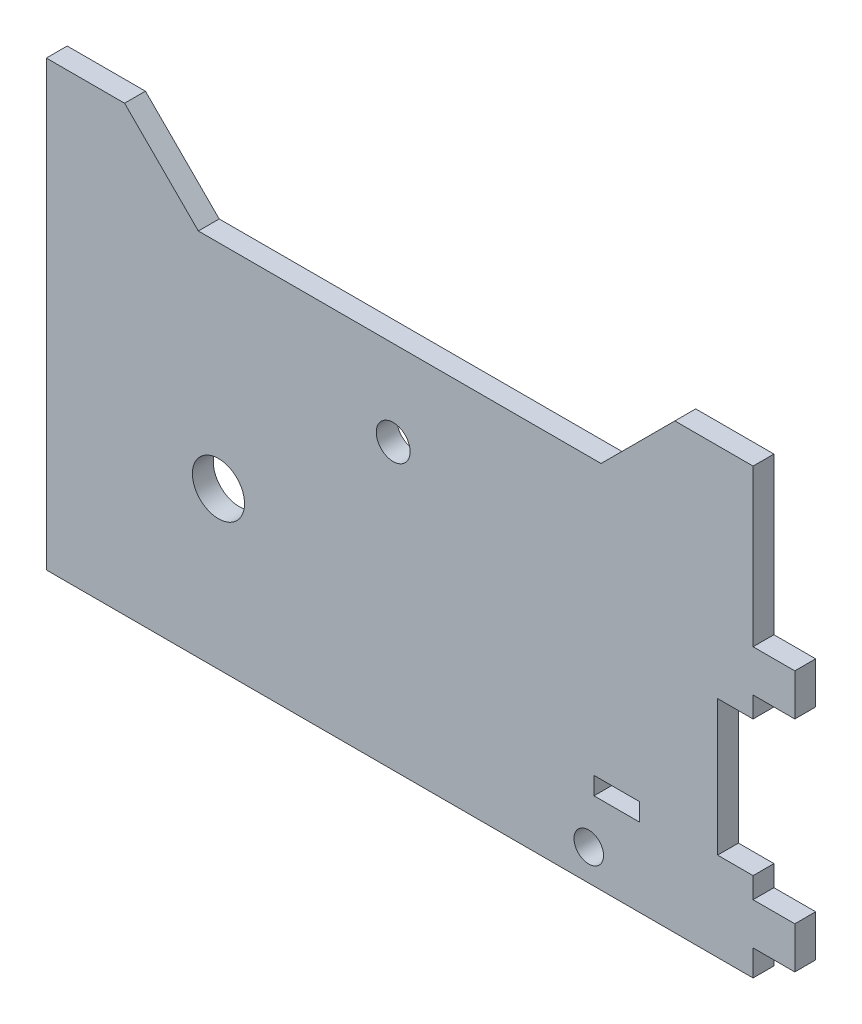
ISO-10303-21;
HEADER;
FILE_DESCRIPTION(('STEP AP214'),'2;1');
FILE_NAME('part.step','',(''),(''),'','','');
FILE_SCHEMA(('AUTOMOTIVE_DESIGN { 1 0 10303 214 1 1 1 1 }'));
ENDSEC;
DATA;
#1=APPLICATION_CONTEXT('core data for automotive mechanical design processes');
#2=APPLICATION_PROTOCOL_DEFINITION('international standard','automotive_design',2000,#1);
#3=PRODUCT_CONTEXT('',#1,'mechanical');
#4=PRODUCT('Part','Part','',(#3));
#5=PRODUCT_RELATED_PRODUCT_CATEGORY('part','',(#4));
#6=PRODUCT_DEFINITION_FORMATION('','',#4);
#7=PRODUCT_DEFINITION_CONTEXT('part definition',#1,'design');
#8=PRODUCT_DEFINITION('design','',#6,#7);
#9=PRODUCT_DEFINITION_SHAPE('','',#8);
#10=(LENGTH_UNIT() NAMED_UNIT(*) SI_UNIT(.MILLI.,.METRE.));
#11=(NAMED_UNIT(*) PLANE_ANGLE_UNIT() SI_UNIT($,.RADIAN.));
#12=(NAMED_UNIT(*) SI_UNIT($,.STERADIAN.) SOLID_ANGLE_UNIT());
#13=UNCERTAINTY_MEASURE_WITH_UNIT(LENGTH_MEASURE(1.E-05),#10,'distance_accuracy_value','');
#14=(GEOMETRIC_REPRESENTATION_CONTEXT(3) GLOBAL_UNCERTAINTY_ASSIGNED_CONTEXT((#13)) GLOBAL_UNIT_ASSIGNED_CONTEXT((#10,
#11,#12)) REPRESENTATION_CONTEXT('',''));
#15=CARTESIAN_POINT('',(0.,0.,0.));
#16=DIRECTION('',(0.,0.,1.));
#17=DIRECTION('',(1.,0.,0.));
#18=AXIS2_PLACEMENT_3D('',#15,#16,#17);
#19=CARTESIAN_POINT('',(0.,0.,4.));
#20=DIRECTION('',(0.,0.,-1.));
#21=DIRECTION('',(-1.,0.,0.));
#22=AXIS2_PLACEMENT_3D('',#19,#20,#21);
#23=PLANE('',#22);
#24=CARTESIAN_POINT('',(-46.,0.,4.));
#25=DIRECTION('',(0.,0.,1.));
#26=DIRECTION('',(1.,0.,0.));
#27=AXIS2_PLACEMENT_3D('',#24,#25,#26);
#28=CIRCLE('',#27,5.);
#29=CARTESIAN_POINT('',(-41.,0.,4.));
#30=VERTEX_POINT('',#29);
#31=EDGE_CURVE('E287',#30,#30,#28,.T.);
#32=ORIENTED_EDGE('',*,*,#31,.F.);
#33=EDGE_LOOP('',(#32));
#34=FACE_BOUND('',#33,.T.);
#35=CARTESIAN_POINT('',(-12.5,24.5,4.));
#36=DIRECTION('',(0.,0.,1.));
#37=DIRECTION('',(1.,0.,0.));
#38=AXIS2_PLACEMENT_3D('',#35,#36,#37);
#39=CIRCLE('',#38,3.25);
#40=CARTESIAN_POINT('',(-9.25,24.5,4.));
#41=VERTEX_POINT('',#40);
#42=EDGE_CURVE('E293',#41,#41,#39,.T.);
#43=ORIENTED_EDGE('',*,*,#42,.F.);
#44=EDGE_LOOP('',(#43));
#45=FACE_BOUND('',#44,.T.);
#46=DIRECTION('',(0.,1.,0.));
#47=VECTOR('',#46,1.);
#48=CARTESIAN_POINT('',(56.5,30.,4.));
#49=LINE('',#48,#47);
#50=CARTESIAN_POINT('',(56.5,25.,4.));
#51=VERTEX_POINT('',#50);
#52=CARTESIAN_POINT('',(56.5,55.,4.));
#53=VERTEX_POINT('',#52);
#54=EDGE_CURVE('E195',#51,#53,#49,.T.);
#55=ORIENTED_EDGE('',*,*,#54,.T.);
#56=DIRECTION('',(-1.,0.,0.));
#57=VECTOR('',#56,1.);
#58=CARTESIAN_POINT('',(56.5,55.,4.));
#59=LINE('',#58,#57);
#60=CARTESIAN_POINT('',(41.5,55.,4.));
#61=VERTEX_POINT('',#60);
#62=EDGE_CURVE('E199',#53,#61,#59,.T.);
#63=ORIENTED_EDGE('',*,*,#62,.T.);
#64=DIRECTION('',(-0.707106781186548,-0.707106781186547,0.));
#65=VECTOR('',#64,1.);
#66=CARTESIAN_POINT('',(41.5,55.,4.));
#67=LINE('',#66,#65);
#68=CARTESIAN_POINT('',(27.357864376269,40.857864376269,4.));
#69=VERTEX_POINT('',#68);
#70=EDGE_CURVE('E221',#61,#69,#67,.T.);
#71=ORIENTED_EDGE('',*,*,#70,.T.);
#72=DIRECTION('',(-1.,0.,0.));
#73=VECTOR('',#72,1.);
#74=CARTESIAN_POINT('',(27.357864376269,40.857864376269,4.));
#75=LINE('',#74,#73);
#76=CARTESIAN_POINT('',(-49.8578643762691,40.857864376269,4.));
#77=VERTEX_POINT('',#76);
#78=EDGE_CURVE('E224',#69,#77,#75,.T.);
#79=ORIENTED_EDGE('',*,*,#78,.T.);
#80=DIRECTION('',(-0.707106781186546,0.707106781186549,0.));
#81=VECTOR('',#80,1.);
#82=CARTESIAN_POINT('',(-49.8578643762691,40.857864376269,4.));
#83=LINE('',#82,#81);
#84=CARTESIAN_POINT('',(-64.,55.,4.));
#85=VERTEX_POINT('',#84);
#86=EDGE_CURVE('E231',#77,#85,#83,.T.);
#87=ORIENTED_EDGE('',*,*,#86,.T.);
#88=DIRECTION('',(-1.,0.,0.));
#89=VECTOR('',#88,1.);
#90=CARTESIAN_POINT('',(-64.,55.,4.));
#91=LINE('',#90,#89);
#92=CARTESIAN_POINT('',(-79.,55.,4.));
#93=VERTEX_POINT('',#92);
#94=EDGE_CURVE('E233',#85,#93,#91,.T.);
#95=ORIENTED_EDGE('',*,*,#94,.T.);
#96=DIRECTION('',(0.,-1.,0.));
#97=VECTOR('',#96,1.);
#98=CARTESIAN_POINT('',(-79.,-30.,4.));
#99=LINE('',#98,#97);
#100=CARTESIAN_POINT('',(-79.,-30.,4.));
#101=VERTEX_POINT('',#100);
#102=EDGE_CURVE('E299',#93,#101,#99,.T.);
#103=ORIENTED_EDGE('',*,*,#102,.T.);
#104=DIRECTION('',(1.,0.,0.));
#105=VECTOR('',#104,1.);
#106=CARTESIAN_POINT('',(-79.,-30.,4.));
#107=LINE('',#106,#105);
#108=CARTESIAN_POINT('',(56.5,-30.,4.));
#109=VERTEX_POINT('',#108);
#110=EDGE_CURVE('E301',#101,#109,#107,.T.);
#111=ORIENTED_EDGE('',*,*,#110,.T.);
#112=DIRECTION('',(0.,1.,0.));
#113=VECTOR('',#112,1.);
#114=CARTESIAN_POINT('',(56.5,-25.,4.));
#115=LINE('',#114,#113);
#116=CARTESIAN_POINT('',(56.5,-25.,4.));
#117=VERTEX_POINT('',#116);
#118=EDGE_CURVE('E303',#109,#117,#115,.T.);
#119=ORIENTED_EDGE('',*,*,#118,.T.);
#120=DIRECTION('',(1.,0.,0.));
#121=VECTOR('',#120,1.);
#122=CARTESIAN_POINT('',(64.5,-25.,4.));
#123=LINE('',#122,#121);
#124=CARTESIAN_POINT('',(64.5,-25.,4.));
#125=VERTEX_POINT('',#124);
#126=EDGE_CURVE('E305',#117,#125,#123,.T.);
#127=ORIENTED_EDGE('',*,*,#126,.T.);
#128=DIRECTION('',(0.,1.,0.));
#129=VECTOR('',#128,1.);
#130=CARTESIAN_POINT('',(64.5,-17.,4.));
#131=LINE('',#130,#129);
#132=CARTESIAN_POINT('',(64.5,-17.,4.));
#133=VERTEX_POINT('',#132);
#134=EDGE_CURVE('E307',#125,#133,#131,.T.);
#135=ORIENTED_EDGE('',*,*,#134,.T.);
#136=DIRECTION('',(-1.,0.,0.));
#137=VECTOR('',#136,1.);
#138=CARTESIAN_POINT('',(56.5,-17.,4.));
#139=LINE('',#138,#137);
#140=CARTESIAN_POINT('',(56.5,-17.,4.));
#141=VERTEX_POINT('',#140);
#142=EDGE_CURVE('E309',#133,#141,#139,.T.);
#143=ORIENTED_EDGE('',*,*,#142,.T.);
#144=DIRECTION('',(0.,1.,0.));
#145=VECTOR('',#144,1.);
#146=CARTESIAN_POINT('',(56.5,-13.,4.));
#147=LINE('',#146,#145);
#148=CARTESIAN_POINT('',(56.5,-13.,4.));
#149=VERTEX_POINT('',#148);
#150=EDGE_CURVE('E311',#141,#149,#147,.T.);
#151=ORIENTED_EDGE('',*,*,#150,.T.);
#152=DIRECTION('',(-1.,0.,0.));
#153=VECTOR('',#152,1.);
#154=CARTESIAN_POINT('',(49.7,-13.,4.));
#155=LINE('',#154,#153);
#156=CARTESIAN_POINT('',(49.7,-13.,4.));
#157=VERTEX_POINT('',#156);
#158=EDGE_CURVE('E313',#149,#157,#155,.T.);
#159=ORIENTED_EDGE('',*,*,#158,.T.);
#160=DIRECTION('',(0.,1.,0.));
#161=VECTOR('',#160,1.);
#162=CARTESIAN_POINT('',(49.7,13.,4.));
#163=LINE('',#162,#161);
#164=CARTESIAN_POINT('',(49.7,13.,4.));
#165=VERTEX_POINT('',#164);
#166=EDGE_CURVE('E315',#157,#165,#163,.T.);
#167=ORIENTED_EDGE('',*,*,#166,.T.);
#168=DIRECTION('',(1.,0.,0.));
#169=VECTOR('',#168,1.);
#170=CARTESIAN_POINT('',(56.5,13.,4.));
#171=LINE('',#170,#169);
#172=CARTESIAN_POINT('',(56.5,13.,4.));
#173=VERTEX_POINT('',#172);
#174=EDGE_CURVE('E317',#165,#173,#171,.T.);
#175=ORIENTED_EDGE('',*,*,#174,.T.);
#176=DIRECTION('',(0.,1.,0.));
#177=VECTOR('',#176,1.);
#178=CARTESIAN_POINT('',(56.5,17.,4.));
#179=LINE('',#178,#177);
#180=CARTESIAN_POINT('',(56.5,17.,4.));
#181=VERTEX_POINT('',#180);
#182=EDGE_CURVE('E319',#173,#181,#179,.T.);
#183=ORIENTED_EDGE('',*,*,#182,.T.);
#184=DIRECTION('',(1.,0.,0.));
#185=VECTOR('',#184,1.);
#186=CARTESIAN_POINT('',(64.5,17.,4.));
#187=LINE('',#186,#185);
#188=CARTESIAN_POINT('',(64.5,17.,4.));
#189=VERTEX_POINT('',#188);
#190=EDGE_CURVE('E321',#181,#189,#187,.T.);
#191=ORIENTED_EDGE('',*,*,#190,.T.);
#192=DIRECTION('',(0.,1.,0.));
#193=VECTOR('',#192,1.);
#194=CARTESIAN_POINT('',(64.5,25.,4.));
#195=LINE('',#194,#193);
#196=CARTESIAN_POINT('',(64.5,25.,4.));
#197=VERTEX_POINT('',#196);
#198=EDGE_CURVE('E323',#189,#197,#195,.T.);
#199=ORIENTED_EDGE('',*,*,#198,.T.);
#200=DIRECTION('',(-1.,0.,0.));
#201=VECTOR('',#200,1.);
#202=CARTESIAN_POINT('',(56.5,25.,4.));
#203=LINE('',#202,#201);
#204=EDGE_CURVE('E202',#197,#51,#203,.T.);
#205=ORIENTED_EDGE('',*,*,#204,.T.);
#206=EDGE_LOOP('',(#55,#63,#71,#79,#87,#95,#103,#111,#119,#127,#135,#143,#151,#159,#167,#175,
#183,#191,#199,#205));
#207=FACE_BOUND('',#206,.T.);
#208=DIRECTION('',(0.,-1.,0.));
#209=VECTOR('',#208,1.);
#210=CARTESIAN_POINT('',(26.,-11.6,4.));
#211=LINE('',#210,#209);
#212=CARTESIAN_POINT('',(26.,-11.6,4.));
#213=VERTEX_POINT('',#212);
#214=CARTESIAN_POINT('',(26.,-15.,4.));
#215=VERTEX_POINT('',#214);
#216=EDGE_CURVE('E261',#213,#215,#211,.T.);
#217=ORIENTED_EDGE('',*,*,#216,.F.);
#218=DIRECTION('',(-1.,0.,0.));
#219=VECTOR('',#218,1.);
#220=CARTESIAN_POINT('',(26.,-11.6,4.));
#221=LINE('',#220,#219);
#222=CARTESIAN_POINT('',(34.7,-11.6,4.));
#223=VERTEX_POINT('',#222);
#224=EDGE_CURVE('E268',#223,#213,#221,.T.);
#225=ORIENTED_EDGE('',*,*,#224,.F.);
#226=DIRECTION('',(0.,1.,0.));
#227=VECTOR('',#226,1.);
#228=CARTESIAN_POINT('',(34.7,-11.6,4.));
#229=LINE('',#228,#227);
#230=CARTESIAN_POINT('',(34.7,-15.,4.));
#231=VERTEX_POINT('',#230);
#232=EDGE_CURVE('E266',#231,#223,#229,.T.);
#233=ORIENTED_EDGE('',*,*,#232,.F.);
#234=DIRECTION('',(1.,0.,0.));
#235=VECTOR('',#234,1.);
#236=CARTESIAN_POINT('',(26.,-15.,4.));
#237=LINE('',#236,#235);
#238=EDGE_CURVE('E263',#215,#231,#237,.T.);
#239=ORIENTED_EDGE('',*,*,#238,.F.);
#240=EDGE_LOOP('',(#217,#225,#233,#239));
#241=FACE_BOUND('',#240,.T.);
#242=CARTESIAN_POINT('',(25.,-24.,4.));
#243=DIRECTION('',(0.,0.,1.));
#244=DIRECTION('',(1.,0.,0.));
#245=AXIS2_PLACEMENT_3D('',#242,#243,#244);
#246=CIRCLE('',#245,2.83);
#247=CARTESIAN_POINT('',(27.83,-24.,4.));
#248=VERTEX_POINT('',#247);
#249=EDGE_CURVE('E256',#248,#248,#246,.T.);
#250=ORIENTED_EDGE('',*,*,#249,.F.);
#251=EDGE_LOOP('',(#250));
#252=FACE_BOUND('',#251,.T.);
#253=ADVANCED_FACE('F33',(#34,#45,#207,#241,#252),#23,.F.);
#254=CARTESIAN_POINT('',(0.,0.,0.));
#255=DIRECTION('',(0.,0.,-1.));
#256=DIRECTION('',(-1.,0.,0.));
#257=AXIS2_PLACEMENT_3D('',#254,#255,#256);
#258=PLANE('',#257);
#259=DIRECTION('',(-1.,0.,0.));
#260=VECTOR('',#259,1.);
#261=CARTESIAN_POINT('',(26.,-11.6,0.));
#262=LINE('',#261,#260);
#263=CARTESIAN_POINT('',(34.7,-11.6,0.));
#264=VERTEX_POINT('',#263);
#265=CARTESIAN_POINT('',(26.,-11.6,0.));
#266=VERTEX_POINT('',#265);
#267=EDGE_CURVE('E264',#264,#266,#262,.T.);
#268=ORIENTED_EDGE('',*,*,#267,.T.);
#269=DIRECTION('',(0.,-1.,0.));
#270=VECTOR('',#269,1.);
#271=CARTESIAN_POINT('',(26.,-11.6,0.));
#272=LINE('',#271,#270);
#273=CARTESIAN_POINT('',(26.,-15.,0.));
#274=VERTEX_POINT('',#273);
#275=EDGE_CURVE('E56',#266,#274,#272,.T.);
#276=ORIENTED_EDGE('',*,*,#275,.T.);
#277=DIRECTION('',(1.,0.,0.));
#278=VECTOR('',#277,1.);
#279=CARTESIAN_POINT('',(26.,-15.,0.));
#280=LINE('',#279,#278);
#281=CARTESIAN_POINT('',(34.7,-15.,0.));
#282=VERTEX_POINT('',#281);
#283=EDGE_CURVE('E272',#274,#282,#280,.T.);
#284=ORIENTED_EDGE('',*,*,#283,.T.);
#285=DIRECTION('',(0.,1.,0.));
#286=VECTOR('',#285,1.);
#287=CARTESIAN_POINT('',(34.7,-11.6,0.));
#288=LINE('',#287,#286);
#289=EDGE_CURVE('E275',#282,#264,#288,.T.);
#290=ORIENTED_EDGE('',*,*,#289,.T.);
#291=EDGE_LOOP('',(#268,#276,#284,#290));
#292=FACE_BOUND('',#291,.T.);
#293=CARTESIAN_POINT('',(-46.,0.,0.));
#294=DIRECTION('',(0.,0.,1.));
#295=DIRECTION('',(1.,0.,0.));
#296=AXIS2_PLACEMENT_3D('',#293,#294,#295);
#297=CIRCLE('',#296,5.);
#298=CARTESIAN_POINT('',(-41.,0.,0.));
#299=VERTEX_POINT('',#298);
#300=EDGE_CURVE('E286',#299,#299,#297,.T.);
#301=ORIENTED_EDGE('',*,*,#300,.T.);
#302=EDGE_LOOP('',(#301));
#303=FACE_BOUND('',#302,.T.);
#304=DIRECTION('',(0.,-1.,0.));
#305=VECTOR('',#304,1.);
#306=CARTESIAN_POINT('',(-79.,-30.,0.));
#307=LINE('',#306,#305);
#308=CARTESIAN_POINT('',(-79.,55.,0.));
#309=VERTEX_POINT('',#308);
#310=CARTESIAN_POINT('',(-79.,-30.,0.));
#311=VERTEX_POINT('',#310);
#312=EDGE_CURVE('E296',#309,#311,#307,.T.);
#313=ORIENTED_EDGE('',*,*,#312,.F.);
#314=DIRECTION('',(-1.,0.,0.));
#315=VECTOR('',#314,1.);
#316=CARTESIAN_POINT('',(-64.,55.,0.));
#317=LINE('',#316,#315);
#318=CARTESIAN_POINT('',(-64.,55.,0.));
#319=VERTEX_POINT('',#318);
#320=EDGE_CURVE('E222',#319,#309,#317,.T.);
#321=ORIENTED_EDGE('',*,*,#320,.F.);
#322=DIRECTION('',(-0.707106781186546,0.707106781186549,0.));
#323=VECTOR('',#322,1.);
#324=CARTESIAN_POINT('',(-49.8578643762691,40.857864376269,0.));
#325=LINE('',#324,#323);
#326=CARTESIAN_POINT('',(-49.8578643762691,40.857864376269,0.));
#327=VERTEX_POINT('',#326);
#328=EDGE_CURVE('E227',#327,#319,#325,.T.);
#329=ORIENTED_EDGE('',*,*,#328,.F.);
#330=DIRECTION('',(-1.,0.,0.));
#331=VECTOR('',#330,1.);
#332=CARTESIAN_POINT('',(27.357864376269,40.857864376269,0.));
#333=LINE('',#332,#331);
#334=CARTESIAN_POINT('',(27.357864376269,40.857864376269,0.));
#335=VERTEX_POINT('',#334);
#336=EDGE_CURVE('E241',#335,#327,#333,.T.);
#337=ORIENTED_EDGE('',*,*,#336,.F.);
#338=DIRECTION('',(-0.707106781186548,-0.707106781186547,0.));
#339=VECTOR('',#338,1.);
#340=CARTESIAN_POINT('',(41.5,55.,0.));
#341=LINE('',#340,#339);
#342=CARTESIAN_POINT('',(41.5,55.,0.));
#343=VERTEX_POINT('',#342);
#344=EDGE_CURVE('E239',#343,#335,#341,.T.);
#345=ORIENTED_EDGE('',*,*,#344,.F.);
#346=DIRECTION('',(-1.,0.,0.));
#347=VECTOR('',#346,1.);
#348=CARTESIAN_POINT('',(56.5,55.,0.));
#349=LINE('',#348,#347);
#350=CARTESIAN_POINT('',(56.5,55.,0.));
#351=VERTEX_POINT('',#350);
#352=EDGE_CURVE('E237',#351,#343,#349,.T.);
#353=ORIENTED_EDGE('',*,*,#352,.F.);
#354=DIRECTION('',(0.,1.,0.));
#355=VECTOR('',#354,1.);
#356=CARTESIAN_POINT('',(56.5,30.,0.));
#357=LINE('',#356,#355);
#358=CARTESIAN_POINT('',(56.5,25.,0.));
#359=VERTEX_POINT('',#358);
#360=EDGE_CURVE('E212',#359,#351,#357,.T.);
#361=ORIENTED_EDGE('',*,*,#360,.F.);
#362=DIRECTION('',(-1.,0.,0.));
#363=VECTOR('',#362,1.);
#364=CARTESIAN_POINT('',(56.5,25.,0.));
#365=LINE('',#364,#363);
#366=CARTESIAN_POINT('',(64.5,25.,0.));
#367=VERTEX_POINT('',#366);
#368=EDGE_CURVE('E352',#367,#359,#365,.T.);
#369=ORIENTED_EDGE('',*,*,#368,.F.);
#370=DIRECTION('',(0.,1.,0.));
#371=VECTOR('',#370,1.);
#372=CARTESIAN_POINT('',(64.5,25.,0.));
#373=LINE('',#372,#371);
#374=CARTESIAN_POINT('',(64.5,17.,0.));
#375=VERTEX_POINT('',#374);
#376=EDGE_CURVE('E350',#375,#367,#373,.T.);
#377=ORIENTED_EDGE('',*,*,#376,.F.);
#378=DIRECTION('',(1.,0.,0.));
#379=VECTOR('',#378,1.);
#380=CARTESIAN_POINT('',(64.5,17.,0.));
#381=LINE('',#380,#379);
#382=CARTESIAN_POINT('',(56.5,17.,0.));
#383=VERTEX_POINT('',#382);
#384=EDGE_CURVE('E348',#383,#375,#381,.T.);
#385=ORIENTED_EDGE('',*,*,#384,.F.);
#386=DIRECTION('',(0.,1.,0.));
#387=VECTOR('',#386,1.);
#388=CARTESIAN_POINT('',(56.5,17.,0.));
#389=LINE('',#388,#387);
#390=CARTESIAN_POINT('',(56.5,13.,0.));
#391=VERTEX_POINT('',#390);
#392=EDGE_CURVE('E346',#391,#383,#389,.T.);
#393=ORIENTED_EDGE('',*,*,#392,.F.);
#394=DIRECTION('',(1.,0.,0.));
#395=VECTOR('',#394,1.);
#396=CARTESIAN_POINT('',(56.5,13.,0.));
#397=LINE('',#396,#395);
#398=CARTESIAN_POINT('',(49.7,13.,0.));
#399=VERTEX_POINT('',#398);
#400=EDGE_CURVE('E344',#399,#391,#397,.T.);
#401=ORIENTED_EDGE('',*,*,#400,.F.);
#402=DIRECTION('',(0.,1.,0.));
#403=VECTOR('',#402,1.);
#404=CARTESIAN_POINT('',(49.7,13.,0.));
#405=LINE('',#404,#403);
#406=CARTESIAN_POINT('',(49.7,-13.,0.));
#407=VERTEX_POINT('',#406);
#408=EDGE_CURVE('E342',#407,#399,#405,.T.);
#409=ORIENTED_EDGE('',*,*,#408,.F.);
#410=DIRECTION('',(-1.,0.,0.));
#411=VECTOR('',#410,1.);
#412=CARTESIAN_POINT('',(49.7,-13.,0.));
#413=LINE('',#412,#411);
#414=CARTESIAN_POINT('',(56.5,-13.,0.));
#415=VERTEX_POINT('',#414);
#416=EDGE_CURVE('E340',#415,#407,#413,.T.);
#417=ORIENTED_EDGE('',*,*,#416,.F.);
#418=DIRECTION('',(0.,1.,0.));
#419=VECTOR('',#418,1.);
#420=CARTESIAN_POINT('',(56.5,-13.,0.));
#421=LINE('',#420,#419);
#422=CARTESIAN_POINT('',(56.5,-17.,0.));
#423=VERTEX_POINT('',#422);
#424=EDGE_CURVE('E338',#423,#415,#421,.T.);
#425=ORIENTED_EDGE('',*,*,#424,.F.);
#426=DIRECTION('',(-1.,0.,0.));
#427=VECTOR('',#426,1.);
#428=CARTESIAN_POINT('',(56.5,-17.,0.));
#429=LINE('',#428,#427);
#430=CARTESIAN_POINT('',(64.5,-17.,0.));
#431=VERTEX_POINT('',#430);
#432=EDGE_CURVE('E336',#431,#423,#429,.T.);
#433=ORIENTED_EDGE('',*,*,#432,.F.);
#434=DIRECTION('',(0.,1.,0.));
#435=VECTOR('',#434,1.);
#436=CARTESIAN_POINT('',(64.5,-17.,0.));
#437=LINE('',#436,#435);
#438=CARTESIAN_POINT('',(64.5,-25.,0.));
#439=VERTEX_POINT('',#438);
#440=EDGE_CURVE('E334',#439,#431,#437,.T.);
#441=ORIENTED_EDGE('',*,*,#440,.F.);
#442=DIRECTION('',(1.,0.,0.));
#443=VECTOR('',#442,1.);
#444=CARTESIAN_POINT('',(64.5,-25.,0.));
#445=LINE('',#444,#443);
#446=CARTESIAN_POINT('',(56.5,-25.,0.));
#447=VERTEX_POINT('',#446);
#448=EDGE_CURVE('E332',#447,#439,#445,.T.);
#449=ORIENTED_EDGE('',*,*,#448,.F.);
#450=DIRECTION('',(0.,1.,0.));
#451=VECTOR('',#450,1.);
#452=CARTESIAN_POINT('',(56.5,-25.,0.));
#453=LINE('',#452,#451);
#454=CARTESIAN_POINT('',(56.5,-30.,0.));
#455=VERTEX_POINT('',#454);
#456=EDGE_CURVE('E330',#455,#447,#453,.T.);
#457=ORIENTED_EDGE('',*,*,#456,.F.);
#458=DIRECTION('',(1.,0.,0.));
#459=VECTOR('',#458,1.);
#460=CARTESIAN_POINT('',(56.5,-30.,0.));
#461=LINE('',#460,#459);
#462=EDGE_CURVE('E328',#311,#455,#461,.T.);
#463=ORIENTED_EDGE('',*,*,#462,.F.);
#464=EDGE_LOOP('',(#313,#321,#329,#337,#345,#353,#361,#369,#377,#385,#393,#401,#409,#417,#425,
#433,#441,#449,#457,#463));
#465=FACE_BOUND('',#464,.T.);
#466=CARTESIAN_POINT('',(-12.5,24.5,0.));
#467=DIRECTION('',(0.,0.,1.));
#468=DIRECTION('',(1.,0.,0.));
#469=AXIS2_PLACEMENT_3D('',#466,#467,#468);
#470=CIRCLE('',#469,3.25);
#471=CARTESIAN_POINT('',(-9.25,24.5,0.));
#472=VERTEX_POINT('',#471);
#473=EDGE_CURVE('E290',#472,#472,#470,.T.);
#474=ORIENTED_EDGE('',*,*,#473,.T.);
#475=EDGE_LOOP('',(#474));
#476=FACE_BOUND('',#475,.T.);
#477=CARTESIAN_POINT('',(25.,-24.,0.));
#478=DIRECTION('',(0.,0.,1.));
#479=DIRECTION('',(1.,0.,0.));
#480=AXIS2_PLACEMENT_3D('',#477,#478,#479);
#481=CIRCLE('',#480,2.83);
#482=CARTESIAN_POINT('',(27.83,-24.,0.));
#483=VERTEX_POINT('',#482);
#484=EDGE_CURVE('E215',#483,#483,#481,.T.);
#485=ORIENTED_EDGE('',*,*,#484,.T.);
#486=EDGE_LOOP('',(#485));
#487=FACE_BOUND('',#486,.T.);
#488=ADVANCED_FACE('F399',(#292,#303,#465,#476,#487),#258,.T.);
#489=CARTESIAN_POINT('',(-79.,-30.,4.));
#490=DIRECTION('',(1.,0.,0.));
#491=DIRECTION('',(0.,0.,-1.));
#492=AXIS2_PLACEMENT_3D('',#489,#490,#491);
#493=PLANE('',#492);
#494=ORIENTED_EDGE('',*,*,#312,.T.);
#495=DIRECTION('',(0.,0.,-1.));
#496=VECTOR('',#495,1.);
#497=CARTESIAN_POINT('',(-79.,-30.,4.));
#498=LINE('',#497,#496);
#499=EDGE_CURVE('E11',#101,#311,#498,.T.);
#500=ORIENTED_EDGE('',*,*,#499,.F.);
#501=ORIENTED_EDGE('',*,*,#102,.F.);
#502=DIRECTION('',(0.,0.,-1.));
#503=VECTOR('',#502,1.);
#504=CARTESIAN_POINT('',(-79.,55.,4.));
#505=LINE('',#504,#503);
#506=EDGE_CURVE('E236',#93,#309,#505,.T.);
#507=ORIENTED_EDGE('',*,*,#506,.T.);
#508=EDGE_LOOP('',(#494,#500,#501,#507));
#509=FACE_BOUND('',#508,.T.);
#510=ADVANCED_FACE('F35',(#509),#493,.F.);
#511=CARTESIAN_POINT('',(56.5,-30.,4.));
#512=DIRECTION('',(0.,1.,0.));
#513=DIRECTION('',(0.,0.,1.));
#514=AXIS2_PLACEMENT_3D('',#511,#512,#513);
#515=PLANE('',#514);
#516=ORIENTED_EDGE('',*,*,#462,.T.);
#517=DIRECTION('',(0.,0.,-1.));
#518=VECTOR('',#517,1.);
#519=CARTESIAN_POINT('',(56.5,-30.,4.));
#520=LINE('',#519,#518);
#521=EDGE_CURVE('E41',#109,#455,#520,.T.);
#522=ORIENTED_EDGE('',*,*,#521,.F.);
#523=ORIENTED_EDGE('',*,*,#110,.F.);
#524=ORIENTED_EDGE('',*,*,#499,.T.);
#525=EDGE_LOOP('',(#516,#522,#523,#524));
#526=FACE_BOUND('',#525,.T.);
#527=ADVANCED_FACE('F414',(#526),#515,.F.);
#528=CARTESIAN_POINT('',(56.5,-25.,4.));
#529=DIRECTION('',(-1.,0.,0.));
#530=DIRECTION('',(0.,-1.,0.));
#531=AXIS2_PLACEMENT_3D('',#528,#529,#530);
#532=PLANE('',#531);
#533=ORIENTED_EDGE('',*,*,#456,.T.);
#534=DIRECTION('',(0.,0.,-1.));
#535=VECTOR('',#534,1.);
#536=CARTESIAN_POINT('',(56.5,-25.,4.));
#537=LINE('',#536,#535);
#538=EDGE_CURVE('E386',#117,#447,#537,.T.);
#539=ORIENTED_EDGE('',*,*,#538,.F.);
#540=ORIENTED_EDGE('',*,*,#118,.F.);
#541=ORIENTED_EDGE('',*,*,#521,.T.);
#542=EDGE_LOOP('',(#533,#539,#540,#541));
#543=FACE_BOUND('',#542,.T.);
#544=ADVANCED_FACE('F393',(#543),#532,.F.);
#545=CARTESIAN_POINT('',(64.5,-25.,4.));
#546=DIRECTION('',(0.,1.,0.));
#547=DIRECTION('',(0.,0.,1.));
#548=AXIS2_PLACEMENT_3D('',#545,#546,#547);
#549=PLANE('',#548);
#550=ORIENTED_EDGE('',*,*,#448,.T.);
#551=DIRECTION('',(0.,0.,-1.));
#552=VECTOR('',#551,1.);
#553=CARTESIAN_POINT('',(64.5,-25.,4.));
#554=LINE('',#553,#552);
#555=EDGE_CURVE('E383',#125,#439,#554,.T.);
#556=ORIENTED_EDGE('',*,*,#555,.F.);
#557=ORIENTED_EDGE('',*,*,#126,.F.);
#558=ORIENTED_EDGE('',*,*,#538,.T.);
#559=EDGE_LOOP('',(#550,#556,#557,#558));
#560=FACE_BOUND('',#559,.T.);
#561=ADVANCED_FACE('F405',(#560),#549,.F.);
#562=CARTESIAN_POINT('',(64.5,-17.,4.));
#563=DIRECTION('',(-1.,0.,0.));
#564=DIRECTION('',(0.,0.,1.));
#565=AXIS2_PLACEMENT_3D('',#562,#563,#564);
#566=PLANE('',#565);
#567=ORIENTED_EDGE('',*,*,#440,.T.);
#568=DIRECTION('',(0.,0.,-1.));
#569=VECTOR('',#568,1.);
#570=CARTESIAN_POINT('',(64.5,-17.,4.));
#571=LINE('',#570,#569);
#572=EDGE_CURVE('E380',#133,#431,#571,.T.);
#573=ORIENTED_EDGE('',*,*,#572,.F.);
#574=ORIENTED_EDGE('',*,*,#134,.F.);
#575=ORIENTED_EDGE('',*,*,#555,.T.);
#576=EDGE_LOOP('',(#567,#573,#574,#575));
#577=FACE_BOUND('',#576,.T.);
#578=ADVANCED_FACE('F409',(#577),#566,.F.);
#579=CARTESIAN_POINT('',(56.5,-17.,4.));
#580=DIRECTION('',(0.,-1.,0.));
#581=DIRECTION('',(0.,0.,-1.));
#582=AXIS2_PLACEMENT_3D('',#579,#580,#581);
#583=PLANE('',#582);
#584=ORIENTED_EDGE('',*,*,#432,.T.);
#585=DIRECTION('',(0.,0.,-1.));
#586=VECTOR('',#585,1.);
#587=CARTESIAN_POINT('',(56.5,-17.,4.));
#588=LINE('',#587,#586);
#589=EDGE_CURVE('E377',#141,#423,#588,.T.);
#590=ORIENTED_EDGE('',*,*,#589,.F.);
#591=ORIENTED_EDGE('',*,*,#142,.F.);
#592=ORIENTED_EDGE('',*,*,#572,.T.);
#593=EDGE_LOOP('',(#584,#590,#591,#592));
#594=FACE_BOUND('',#593,.T.);
#595=ADVANCED_FACE('F491',(#594),#583,.F.);
#596=CARTESIAN_POINT('',(56.5,-13.,4.));
#597=DIRECTION('',(-1.,0.,0.));
#598=DIRECTION('',(0.,-1.,0.));
#599=AXIS2_PLACEMENT_3D('',#596,#597,#598);
#600=PLANE('',#599);
#601=ORIENTED_EDGE('',*,*,#424,.T.);
#602=DIRECTION('',(0.,0.,-1.));
#603=VECTOR('',#602,1.);
#604=CARTESIAN_POINT('',(56.5,-13.,4.));
#605=LINE('',#604,#603);
#606=EDGE_CURVE('E374',#149,#415,#605,.T.);
#607=ORIENTED_EDGE('',*,*,#606,.F.);
#608=ORIENTED_EDGE('',*,*,#150,.F.);
#609=ORIENTED_EDGE('',*,*,#589,.T.);
#610=EDGE_LOOP('',(#601,#607,#608,#609));
#611=FACE_BOUND('',#610,.T.);
#612=ADVANCED_FACE('F487',(#611),#600,.F.);
#613=CARTESIAN_POINT('',(49.7,-13.,4.));
#614=DIRECTION('',(0.,-1.,0.));
#615=DIRECTION('',(1.,0.,0.));
#616=AXIS2_PLACEMENT_3D('',#613,#614,#615);
#617=PLANE('',#616);
#618=ORIENTED_EDGE('',*,*,#416,.T.);
#619=DIRECTION('',(0.,0.,-1.));
#620=VECTOR('',#619,1.);
#621=CARTESIAN_POINT('',(49.7,-13.,4.));
#622=LINE('',#621,#620);
#623=EDGE_CURVE('E371',#157,#407,#622,.T.);
#624=ORIENTED_EDGE('',*,*,#623,.F.);
#625=ORIENTED_EDGE('',*,*,#158,.F.);
#626=ORIENTED_EDGE('',*,*,#606,.T.);
#627=EDGE_LOOP('',(#618,#624,#625,#626));
#628=FACE_BOUND('',#627,.T.);
#629=ADVANCED_FACE('F483',(#628),#617,.F.);
#630=CARTESIAN_POINT('',(49.7,13.,4.));
#631=DIRECTION('',(-1.,0.,0.));
#632=DIRECTION('',(0.,-1.,0.));
#633=AXIS2_PLACEMENT_3D('',#630,#631,#632);
#634=PLANE('',#633);
#635=ORIENTED_EDGE('',*,*,#408,.T.);
#636=DIRECTION('',(0.,0.,-1.));
#637=VECTOR('',#636,1.);
#638=CARTESIAN_POINT('',(49.7,13.,4.));
#639=LINE('',#638,#637);
#640=EDGE_CURVE('E368',#165,#399,#639,.T.);
#641=ORIENTED_EDGE('',*,*,#640,.F.);
#642=ORIENTED_EDGE('',*,*,#166,.F.);
#643=ORIENTED_EDGE('',*,*,#623,.T.);
#644=EDGE_LOOP('',(#635,#641,#642,#643));
#645=FACE_BOUND('',#644,.T.);
#646=ADVANCED_FACE('F479',(#645),#634,.F.);
#647=CARTESIAN_POINT('',(56.5,13.,4.));
#648=DIRECTION('',(0.,1.,0.));
#649=DIRECTION('',(-1.,0.,0.));
#650=AXIS2_PLACEMENT_3D('',#647,#648,#649);
#651=PLANE('',#650);
#652=ORIENTED_EDGE('',*,*,#400,.T.);
#653=DIRECTION('',(0.,0.,-1.));
#654=VECTOR('',#653,1.);
#655=CARTESIAN_POINT('',(56.5,13.,4.));
#656=LINE('',#655,#654);
#657=EDGE_CURVE('E365',#173,#391,#656,.T.);
#658=ORIENTED_EDGE('',*,*,#657,.F.);
#659=ORIENTED_EDGE('',*,*,#174,.F.);
#660=ORIENTED_EDGE('',*,*,#640,.T.);
#661=EDGE_LOOP('',(#652,#658,#659,#660));
#662=FACE_BOUND('',#661,.T.);
#663=ADVANCED_FACE('F475',(#662),#651,.F.);
#664=CARTESIAN_POINT('',(56.5,17.,4.));
#665=DIRECTION('',(-1.,0.,0.));
#666=DIRECTION('',(0.,0.,1.));
#667=AXIS2_PLACEMENT_3D('',#664,#665,#666);
#668=PLANE('',#667);
#669=ORIENTED_EDGE('',*,*,#392,.T.);
#670=DIRECTION('',(0.,0.,-1.));
#671=VECTOR('',#670,1.);
#672=CARTESIAN_POINT('',(56.5,17.,4.));
#673=LINE('',#672,#671);
#674=EDGE_CURVE('E362',#181,#383,#673,.T.);
#675=ORIENTED_EDGE('',*,*,#674,.F.);
#676=ORIENTED_EDGE('',*,*,#182,.F.);
#677=ORIENTED_EDGE('',*,*,#657,.T.);
#678=EDGE_LOOP('',(#669,#675,#676,#677));
#679=FACE_BOUND('',#678,.T.);
#680=ADVANCED_FACE('F471',(#679),#668,.F.);
#681=CARTESIAN_POINT('',(64.5,17.,4.));
#682=DIRECTION('',(0.,1.,0.));
#683=DIRECTION('',(0.,0.,1.));
#684=AXIS2_PLACEMENT_3D('',#681,#682,#683);
#685=PLANE('',#684);
#686=ORIENTED_EDGE('',*,*,#384,.T.);
#687=DIRECTION('',(0.,0.,-1.));
#688=VECTOR('',#687,1.);
#689=CARTESIAN_POINT('',(64.5,17.,4.));
#690=LINE('',#689,#688);
#691=EDGE_CURVE('E359',#189,#375,#690,.T.);
#692=ORIENTED_EDGE('',*,*,#691,.F.);
#693=ORIENTED_EDGE('',*,*,#190,.F.);
#694=ORIENTED_EDGE('',*,*,#674,.T.);
#695=EDGE_LOOP('',(#686,#692,#693,#694));
#696=FACE_BOUND('',#695,.T.);
#697=ADVANCED_FACE('F467',(#696),#685,.F.);
#698=CARTESIAN_POINT('',(64.5,25.,4.));
#699=DIRECTION('',(-1.,0.,0.));
#700=DIRECTION('',(0.,0.,1.));
#701=AXIS2_PLACEMENT_3D('',#698,#699,#700);
#702=PLANE('',#701);
#703=ORIENTED_EDGE('',*,*,#376,.T.);
#704=DIRECTION('',(0.,0.,-1.));
#705=VECTOR('',#704,1.);
#706=CARTESIAN_POINT('',(64.5,25.,4.));
#707=LINE('',#706,#705);
#708=EDGE_CURVE('E356',#197,#367,#707,.T.);
#709=ORIENTED_EDGE('',*,*,#708,.F.);
#710=ORIENTED_EDGE('',*,*,#198,.F.);
#711=ORIENTED_EDGE('',*,*,#691,.T.);
#712=EDGE_LOOP('',(#703,#709,#710,#711));
#713=FACE_BOUND('',#712,.T.);
#714=ADVANCED_FACE('F463',(#713),#702,.F.);
#715=CARTESIAN_POINT('',(56.5,25.,4.));
#716=DIRECTION('',(0.,-1.,0.));
#717=DIRECTION('',(0.,0.,-1.));
#718=AXIS2_PLACEMENT_3D('',#715,#716,#717);
#719=PLANE('',#718);
#720=ORIENTED_EDGE('',*,*,#368,.T.);
#721=DIRECTION('',(0.,0.,-1.));
#722=VECTOR('',#721,1.);
#723=CARTESIAN_POINT('',(56.5,25.,4.));
#724=LINE('',#723,#722);
#725=EDGE_CURVE('E206',#51,#359,#724,.T.);
#726=ORIENTED_EDGE('',*,*,#725,.F.);
#727=ORIENTED_EDGE('',*,*,#204,.F.);
#728=ORIENTED_EDGE('',*,*,#708,.T.);
#729=EDGE_LOOP('',(#720,#726,#727,#728));
#730=FACE_BOUND('',#729,.T.);
#731=ADVANCED_FACE('F460',(#730),#719,.F.);
#732=CARTESIAN_POINT('',(56.5,30.,4.));
#733=DIRECTION('',(-1.,0.,0.));
#734=DIRECTION('',(0.,0.,1.));
#735=AXIS2_PLACEMENT_3D('',#732,#733,#734);
#736=PLANE('',#735);
#737=ORIENTED_EDGE('',*,*,#360,.T.);
#738=DIRECTION('',(0.,0.,-1.));
#739=VECTOR('',#738,1.);
#740=CARTESIAN_POINT('',(56.5,55.,4.));
#741=LINE('',#740,#739);
#742=EDGE_CURVE('E209',#53,#351,#741,.T.);
#743=ORIENTED_EDGE('',*,*,#742,.F.);
#744=ORIENTED_EDGE('',*,*,#54,.F.);
#745=ORIENTED_EDGE('',*,*,#725,.T.);
#746=EDGE_LOOP('',(#737,#743,#744,#745));
#747=FACE_BOUND('',#746,.T.);
#748=ADVANCED_FACE('F210',(#747),#736,.F.);
#749=CARTESIAN_POINT('',(-12.5,24.5,4.));
#750=DIRECTION('',(0.,0.,-1.));
#751=DIRECTION('',(-1.,0.,0.));
#752=AXIS2_PLACEMENT_3D('',#749,#750,#751);
#753=CYLINDRICAL_SURFACE('',#752,3.25);
#754=ORIENTED_EDGE('',*,*,#42,.T.);
#755=EDGE_LOOP('',(#754));
#756=FACE_BOUND('',#755,.T.);
#757=ORIENTED_EDGE('',*,*,#473,.F.);
#758=EDGE_LOOP('',(#757));
#759=FACE_BOUND('',#758,.T.);
#760=ADVANCED_FACE('F455',(#756,#759),#753,.F.);
#761=CARTESIAN_POINT('',(-46.,0.,4.));
#762=DIRECTION('',(0.,0.,-1.));
#763=DIRECTION('',(-1.,0.,0.));
#764=AXIS2_PLACEMENT_3D('',#761,#762,#763);
#765=CYLINDRICAL_SURFACE('',#764,5.);
#766=ORIENTED_EDGE('',*,*,#31,.T.);
#767=EDGE_LOOP('',(#766));
#768=FACE_BOUND('',#767,.T.);
#769=ORIENTED_EDGE('',*,*,#300,.F.);
#770=EDGE_LOOP('',(#769));
#771=FACE_BOUND('',#770,.T.);
#772=ADVANCED_FACE('F566',(#768,#771),#765,.F.);
#773=CARTESIAN_POINT('',(26.,-11.6,4.));
#774=DIRECTION('',(1.,0.,0.));
#775=DIRECTION('',(0.,0.,-1.));
#776=AXIS2_PLACEMENT_3D('',#773,#774,#775);
#777=PLANE('',#776);
#778=ORIENTED_EDGE('',*,*,#275,.F.);
#779=DIRECTION('',(0.,0.,-1.));
#780=VECTOR('',#779,1.);
#781=CARTESIAN_POINT('',(26.,-11.6,4.));
#782=LINE('',#781,#780);
#783=EDGE_CURVE('E270',#213,#266,#782,.T.);
#784=ORIENTED_EDGE('',*,*,#783,.F.);
#785=ORIENTED_EDGE('',*,*,#216,.T.);
#786=DIRECTION('',(0.,0.,-1.));
#787=VECTOR('',#786,1.);
#788=CARTESIAN_POINT('',(26.,-15.,4.));
#789=LINE('',#788,#787);
#790=EDGE_CURVE('E284',#215,#274,#789,.T.);
#791=ORIENTED_EDGE('',*,*,#790,.T.);
#792=EDGE_LOOP('',(#778,#784,#785,#791));
#793=FACE_BOUND('',#792,.T.);
#794=ADVANCED_FACE('F556',(#793),#777,.T.);
#795=CARTESIAN_POINT('',(26.,-15.,4.));
#796=DIRECTION('',(0.,1.,0.));
#797=DIRECTION('',(0.,0.,1.));
#798=AXIS2_PLACEMENT_3D('',#795,#796,#797);
#799=PLANE('',#798);
#800=ORIENTED_EDGE('',*,*,#283,.F.);
#801=ORIENTED_EDGE('',*,*,#790,.F.);
#802=ORIENTED_EDGE('',*,*,#238,.T.);
#803=DIRECTION('',(0.,0.,-1.));
#804=VECTOR('',#803,1.);
#805=CARTESIAN_POINT('',(34.7,-15.,4.));
#806=LINE('',#805,#804);
#807=EDGE_CURVE('E282',#231,#282,#806,.T.);
#808=ORIENTED_EDGE('',*,*,#807,.T.);
#809=EDGE_LOOP('',(#800,#801,#802,#808));
#810=FACE_BOUND('',#809,.T.);
#811=ADVANCED_FACE('F546',(#810),#799,.T.);
#812=CARTESIAN_POINT('',(34.7,-11.6,4.));
#813=DIRECTION('',(-1.,0.,0.));
#814=DIRECTION('',(0.,0.,1.));
#815=AXIS2_PLACEMENT_3D('',#812,#813,#814);
#816=PLANE('',#815);
#817=ORIENTED_EDGE('',*,*,#289,.F.);
#818=ORIENTED_EDGE('',*,*,#807,.F.);
#819=ORIENTED_EDGE('',*,*,#232,.T.);
#820=DIRECTION('',(0.,0.,-1.));
#821=VECTOR('',#820,1.);
#822=CARTESIAN_POINT('',(34.7,-11.6,4.));
#823=LINE('',#822,#821);
#824=EDGE_CURVE('E48',#223,#264,#823,.T.);
#825=ORIENTED_EDGE('',*,*,#824,.T.);
#826=EDGE_LOOP('',(#817,#818,#819,#825));
#827=FACE_BOUND('',#826,.T.);
#828=ADVANCED_FACE('F537',(#827),#816,.T.);
#829=CARTESIAN_POINT('',(26.,-11.6,4.));
#830=DIRECTION('',(0.,-1.,0.));
#831=DIRECTION('',(1.,0.,0.));
#832=AXIS2_PLACEMENT_3D('',#829,#830,#831);
#833=PLANE('',#832);
#834=ORIENTED_EDGE('',*,*,#267,.F.);
#835=ORIENTED_EDGE('',*,*,#824,.F.);
#836=ORIENTED_EDGE('',*,*,#224,.T.);
#837=ORIENTED_EDGE('',*,*,#783,.T.);
#838=EDGE_LOOP('',(#834,#835,#836,#837));
#839=FACE_BOUND('',#838,.T.);
#840=ADVANCED_FACE('F527',(#839),#833,.T.);
#841=CARTESIAN_POINT('',(25.,-24.,4.));
#842=DIRECTION('',(0.,0.,-1.));
#843=DIRECTION('',(-1.,0.,0.));
#844=AXIS2_PLACEMENT_3D('',#841,#842,#843);
#845=CYLINDRICAL_SURFACE('',#844,2.83);
#846=ORIENTED_EDGE('',*,*,#249,.T.);
#847=EDGE_LOOP('',(#846));
#848=FACE_BOUND('',#847,.T.);
#849=ORIENTED_EDGE('',*,*,#484,.F.);
#850=EDGE_LOOP('',(#849));
#851=FACE_BOUND('',#850,.T.);
#852=ADVANCED_FACE('F442',(#848,#851),#845,.F.);
#853=CARTESIAN_POINT('',(56.5,55.,4.));
#854=DIRECTION('',(0.,-1.,0.));
#855=DIRECTION('',(0.,0.,-1.));
#856=AXIS2_PLACEMENT_3D('',#853,#854,#855);
#857=PLANE('',#856);
#858=ORIENTED_EDGE('',*,*,#352,.T.);
#859=DIRECTION('',(0.,0.,-1.));
#860=VECTOR('',#859,1.);
#861=CARTESIAN_POINT('',(41.5,55.,4.));
#862=LINE('',#861,#860);
#863=EDGE_CURVE('E216',#61,#343,#862,.T.);
#864=ORIENTED_EDGE('',*,*,#863,.F.);
#865=ORIENTED_EDGE('',*,*,#62,.F.);
#866=ORIENTED_EDGE('',*,*,#742,.T.);
#867=EDGE_LOOP('',(#858,#864,#865,#866));
#868=FACE_BOUND('',#867,.T.);
#869=ADVANCED_FACE('F218',(#868),#857,.F.);
#870=CARTESIAN_POINT('',(41.5,55.,4.));
#871=DIRECTION('',(0.707106781186547,-0.707106781186549,0.));
#872=DIRECTION('',(0.707106781186549,0.707106781186547,0.));
#873=AXIS2_PLACEMENT_3D('',#870,#871,#872);
#874=PLANE('',#873);
#875=ORIENTED_EDGE('',*,*,#344,.T.);
#876=DIRECTION('',(0.,0.,-1.));
#877=VECTOR('',#876,1.);
#878=CARTESIAN_POINT('',(27.357864376269,40.857864376269,4.));
#879=LINE('',#878,#877);
#880=EDGE_CURVE('E252',#69,#335,#879,.T.);
#881=ORIENTED_EDGE('',*,*,#880,.F.);
#882=ORIENTED_EDGE('',*,*,#70,.F.);
#883=ORIENTED_EDGE('',*,*,#863,.T.);
#884=EDGE_LOOP('',(#875,#881,#882,#883));
#885=FACE_BOUND('',#884,.T.);
#886=ADVANCED_FACE('F434',(#885),#874,.F.);
#887=CARTESIAN_POINT('',(27.357864376269,40.857864376269,4.));
#888=DIRECTION('',(0.,-1.,0.));
#889=DIRECTION('',(1.,0.,0.));
#890=AXIS2_PLACEMENT_3D('',#887,#888,#889);
#891=PLANE('',#890);
#892=ORIENTED_EDGE('',*,*,#336,.T.);
#893=DIRECTION('',(0.,0.,-1.));
#894=VECTOR('',#893,1.);
#895=CARTESIAN_POINT('',(-49.8578643762691,40.857864376269,4.));
#896=LINE('',#895,#894);
#897=EDGE_CURVE('E249',#77,#327,#896,.T.);
#898=ORIENTED_EDGE('',*,*,#897,.F.);
#899=ORIENTED_EDGE('',*,*,#78,.F.);
#900=ORIENTED_EDGE('',*,*,#880,.T.);
#901=EDGE_LOOP('',(#892,#898,#899,#900));
#902=FACE_BOUND('',#901,.T.);
#903=ADVANCED_FACE('F430',(#902),#891,.F.);
#904=CARTESIAN_POINT('',(-49.8578643762691,40.857864376269,4.));
#905=DIRECTION('',(-0.707106781186549,-0.707106781186546,0.));
#906=DIRECTION('',(0.707106781186546,-0.707106781186549,0.));
#907=AXIS2_PLACEMENT_3D('',#904,#905,#906);
#908=PLANE('',#907);
#909=ORIENTED_EDGE('',*,*,#328,.T.);
#910=DIRECTION('',(0.,0.,-1.));
#911=VECTOR('',#910,1.);
#912=CARTESIAN_POINT('',(-64.,55.,4.));
#913=LINE('',#912,#911);
#914=EDGE_CURVE('E246',#85,#319,#913,.T.);
#915=ORIENTED_EDGE('',*,*,#914,.F.);
#916=ORIENTED_EDGE('',*,*,#86,.F.);
#917=ORIENTED_EDGE('',*,*,#897,.T.);
#918=EDGE_LOOP('',(#909,#915,#916,#917));
#919=FACE_BOUND('',#918,.T.);
#920=ADVANCED_FACE('F425',(#919),#908,.F.);
#921=CARTESIAN_POINT('',(-64.,55.,4.));
#922=DIRECTION('',(0.,-1.,0.));
#923=DIRECTION('',(1.,0.,0.));
#924=AXIS2_PLACEMENT_3D('',#921,#922,#923);
#925=PLANE('',#924);
#926=ORIENTED_EDGE('',*,*,#320,.T.);
#927=ORIENTED_EDGE('',*,*,#506,.F.);
#928=ORIENTED_EDGE('',*,*,#94,.F.);
#929=ORIENTED_EDGE('',*,*,#914,.T.);
#930=EDGE_LOOP('',(#926,#927,#928,#929));
#931=FACE_BOUND('',#930,.T.);
#932=ADVANCED_FACE('F420',(#931),#925,.F.);
#933=CLOSED_SHELL('',(#253,#488,#510,#527,#544,#561,#578,#595,#612,#629,#646,#663,#680,#697,
#714,#731,#748,#760,#772,#794,#811,#828,#840,#852,#869,#886,#903,#920,#932));
#934=MANIFOLD_SOLID_BREP('B2',#933);
#935=ADVANCED_BREP_SHAPE_REPRESENTATION('',(#18,#934),#14);
#936=SHAPE_DEFINITION_REPRESENTATION(#9,#935);
ENDSEC;
END-ISO-10303-21;
